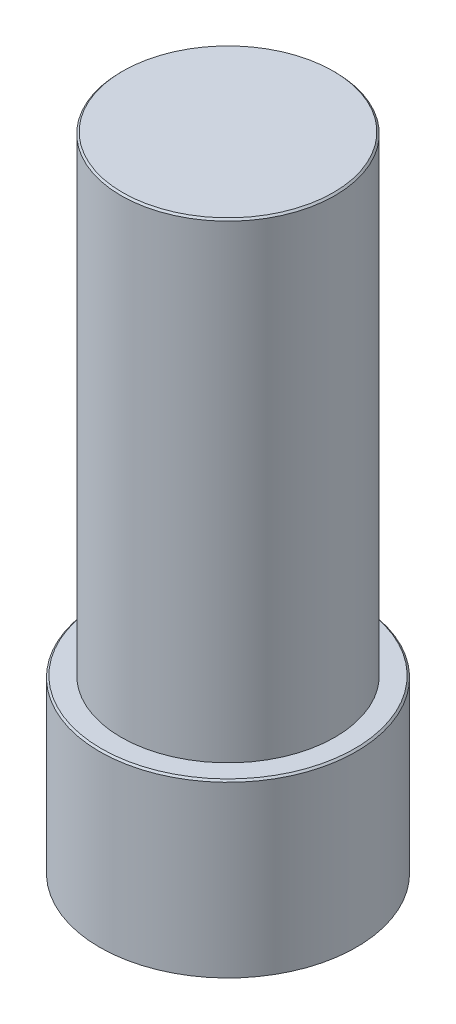
ISO-10303-21;
HEADER;
FILE_DESCRIPTION(('STEP AP214'),'2;1');
FILE_NAME('part.step','',(''),(''),'','','');
FILE_SCHEMA(('AUTOMOTIVE_DESIGN { 1 0 10303 214 1 1 1 1 }'));
ENDSEC;
DATA;
#1=APPLICATION_CONTEXT('core data for automotive mechanical design processes');
#2=APPLICATION_PROTOCOL_DEFINITION('international standard','automotive_design',2000,#1);
#3=PRODUCT_CONTEXT('',#1,'mechanical');
#4=PRODUCT('Part','Part','',(#3));
#5=PRODUCT_RELATED_PRODUCT_CATEGORY('part','',(#4));
#6=PRODUCT_DEFINITION_FORMATION('','',#4);
#7=PRODUCT_DEFINITION_CONTEXT('part definition',#1,'design');
#8=PRODUCT_DEFINITION('design','',#6,#7);
#9=PRODUCT_DEFINITION_SHAPE('','',#8);
#10=(LENGTH_UNIT() NAMED_UNIT(*) SI_UNIT(.MILLI.,.METRE.));
#11=(NAMED_UNIT(*) PLANE_ANGLE_UNIT() SI_UNIT($,.RADIAN.));
#12=(NAMED_UNIT(*) SI_UNIT($,.STERADIAN.) SOLID_ANGLE_UNIT());
#13=UNCERTAINTY_MEASURE_WITH_UNIT(LENGTH_MEASURE(1.E-05),#10,'distance_accuracy_value','');
#14=(GEOMETRIC_REPRESENTATION_CONTEXT(3) GLOBAL_UNCERTAINTY_ASSIGNED_CONTEXT((#13)) GLOBAL_UNIT_ASSIGNED_CONTEXT((#10,
#11,#12)) REPRESENTATION_CONTEXT('',''));
#15=CARTESIAN_POINT('',(0.,0.,0.));
#16=DIRECTION('',(0.,0.,1.));
#17=DIRECTION('',(1.,0.,0.));
#18=AXIS2_PLACEMENT_3D('',#15,#16,#17);
#19=CARTESIAN_POINT('',(0.,75.,0.));
#20=DIRECTION('',(0.,-1.,0.));
#21=DIRECTION('',(0.,0.,-1.));
#22=AXIS2_PLACEMENT_3D('',#19,#20,#21);
#23=CYLINDRICAL_SURFACE('',#22,15.);
#24=CARTESIAN_POINT('',(0.,19.8,0.));
#25=DIRECTION('',(0.,1.,0.));
#26=DIRECTION('',(0.,0.,1.));
#27=AXIS2_PLACEMENT_3D('',#24,#25,#26);
#28=CIRCLE('',#27,15.);
#29=CARTESIAN_POINT('',(0.,19.8,15.));
#30=VERTEX_POINT('',#29);
#31=EDGE_CURVE('E132',#30,#30,#28,.F.);
#32=ORIENTED_EDGE('',*,*,#31,.T.);
#33=EDGE_LOOP('',(#32));
#34=FACE_BOUND('',#33,.T.);
#35=CARTESIAN_POINT('',(0.,0.,0.));
#36=DIRECTION('',(0.,1.,0.));
#37=DIRECTION('',(0.,0.,1.));
#38=AXIS2_PLACEMENT_3D('',#35,#36,#37);
#39=CIRCLE('',#38,15.);
#40=CARTESIAN_POINT('',(0.,0.,15.));
#41=VERTEX_POINT('',#40);
#42=EDGE_CURVE('E124',#41,#41,#39,.T.);
#43=ORIENTED_EDGE('',*,*,#42,.T.);
#44=EDGE_LOOP('',(#43));
#45=FACE_BOUND('',#44,.T.);
#46=ADVANCED_FACE('F41',(#34,#45),#23,.T.);
#47=CARTESIAN_POINT('',(0.,0.,0.));
#48=DIRECTION('',(0.,1.,0.));
#49=DIRECTION('',(0.,0.,1.));
#50=AXIS2_PLACEMENT_3D('',#47,#48,#49);
#51=PLANE('',#50);
#52=ORIENTED_EDGE('',*,*,#42,.F.);
#53=EDGE_LOOP('',(#52));
#54=FACE_BOUND('',#53,.T.);
#55=ADVANCED_FACE('F185',(#54),#51,.F.);
#56=CARTESIAN_POINT('',(0.,20.,0.));
#57=DIRECTION('',(0.,1.,0.));
#58=DIRECTION('',(0.,0.,1.));
#59=AXIS2_PLACEMENT_3D('',#56,#57,#58);
#60=PLANE('',#59);
#61=CARTESIAN_POINT('',(0.,20.,0.));
#62=DIRECTION('',(0.,1.,0.));
#63=DIRECTION('',(0.,0.,1.));
#64=AXIS2_PLACEMENT_3D('',#61,#62,#63);
#65=CIRCLE('',#64,14.8);
#66=CARTESIAN_POINT('',(0.,20.,14.8));
#67=VERTEX_POINT('',#66);
#68=EDGE_CURVE('E128',#67,#67,#65,.T.);
#69=ORIENTED_EDGE('',*,*,#68,.T.);
#70=EDGE_LOOP('',(#69));
#71=FACE_BOUND('',#70,.T.);
#72=CARTESIAN_POINT('',(0.,20.,0.));
#73=DIRECTION('',(0.,1.,0.));
#74=DIRECTION('',(0.,0.,1.));
#75=AXIS2_PLACEMENT_3D('',#72,#73,#74);
#76=CIRCLE('',#75,12.5);
#77=CARTESIAN_POINT('',(0.,20.,12.5));
#78=VERTEX_POINT('',#77);
#79=EDGE_CURVE('E114',#78,#78,#76,.T.);
#80=ORIENTED_EDGE('',*,*,#79,.F.);
#81=EDGE_LOOP('',(#80));
#82=FACE_BOUND('',#81,.T.);
#83=ADVANCED_FACE('F179',(#71,#82),#60,.T.);
#84=CARTESIAN_POINT('',(0.,20.,0.));
#85=DIRECTION('',(0.,1.,0.));
#86=DIRECTION('',(0.,0.,1.));
#87=AXIS2_PLACEMENT_3D('',#84,#85,#86);
#88=CYLINDRICAL_SURFACE('',#87,12.5);
#89=CARTESIAN_POINT('',(3.25,45.,-12.0701077045733));
#90=CARTESIAN_POINT('',(3.25001054641698,44.9102469923514,-12.0700972014568));
#91=CARTESIAN_POINT('',(3.2462821971101,44.8205003351103,-12.0711085697672));
#92=CARTESIAN_POINT('',(3.23142964516638,44.6416806479744,-12.0750971218678));
#93=CARTESIAN_POINT('',(3.22030676327856,44.5526075006559,-12.0780739546028));
#94=CARTESIAN_POINT('',(3.19077775024691,44.3759470317223,-12.0859074104892));
#95=CARTESIAN_POINT('',(3.17238680541051,44.2883570066258,-12.0907601136305));
#96=CARTESIAN_POINT('',(3.12849426751624,44.1151162303061,-12.102191291883));
#97=CARTESIAN_POINT('',(3.10299256067524,44.0294655101386,-12.1087697946097));
#98=CARTESIAN_POINT('',(3.01610723550645,43.7763394826096,-12.1308168028862));
#99=CARTESIAN_POINT('',(2.94431200667787,43.612504190267,-12.1486056733553));
#100=CARTESIAN_POINT('',(2.7751834959888,43.2992323440276,-12.1883491724256));
#101=CARTESIAN_POINT('',(2.67784242416883,43.1498002012703,-12.2103050711557));
#102=CARTESIAN_POINT('',(2.45790723279837,42.8659697818068,-12.2564903841655));
#103=CARTESIAN_POINT('',(2.33481901404868,42.7319598995167,-12.2807582867324));
#104=CARTESIAN_POINT('',(2.06794376168588,42.4862329164713,-12.3285017577223));
#105=CARTESIAN_POINT('',(1.92415339609513,42.3745194112024,-12.3519771978473));
#106=CARTESIAN_POINT('',(1.61725751153118,42.1749378641374,-12.3959199464695));
#107=CARTESIAN_POINT('',(1.45389212276499,42.0874571740681,-12.416336231863));
#108=CARTESIAN_POINT('',(1.11416201723522,41.9413538371338,-12.4514159376555));
#109=CARTESIAN_POINT('',(0.937800013503568,41.8827251869403,-12.466080554692));
#110=CARTESIAN_POINT('',(0.581159693741104,41.7972449245453,-12.487732327864));
#111=CARTESIAN_POINT('',(0.401050786420688,41.7697278848197,-12.4948800160932));
#112=CARTESIAN_POINT('',(0.0386367576122468,41.7451603299802,-12.5012531822562));
#113=CARTESIAN_POINT('',(-0.143668058423004,41.7481056253152,-12.500479749599));
#114=CARTESIAN_POINT('',(-0.50066595555858,41.7839076611296,-12.4912158940811));
#115=CARTESIAN_POINT('',(-0.675436720490978,41.8160450885361,-12.4829110578883));
#116=CARTESIAN_POINT('',(-1.01701237228166,41.9081588608412,-12.459735475173));
#117=CARTESIAN_POINT('',(-1.18381689078128,41.9681364916968,-12.4448644253543));
#118=CARTESIAN_POINT('',(-1.5065891753543,42.114793443658,-12.409948350159));
#119=CARTESIAN_POINT('',(-1.66243761523551,42.2017234290582,-12.3898550527595));
#120=CARTESIAN_POINT('',(-1.95757909796545,42.3996212753068,-12.3466661055975));
#121=CARTESIAN_POINT('',(-2.09686940130557,42.510593105279,-12.3235699603401));
#122=CARTESIAN_POINT('',(-2.35922425296155,42.7572556655012,-12.276089499668));
#123=CARTESIAN_POINT('',(-2.48169820462864,42.8935720998935,-12.2516872576503));
#124=CARTESIAN_POINT('',(-2.70220949562019,43.1850632178379,-12.204949898371));
#125=CARTESIAN_POINT('',(-2.80024010996337,43.3402430737657,-12.1826153510449));
#126=CARTESIAN_POINT('',(-2.96954068537913,43.6664928224593,-12.142466983971));
#127=CARTESIAN_POINT('',(-3.04064266225175,43.8376544188678,-12.1246817597345));
#128=CARTESIAN_POINT('',(-3.12474953065326,44.1016655508393,-12.10317085816));
#129=CARTESIAN_POINT('',(-3.14902543900197,44.1908662208967,-12.0968622953971));
#130=CARTESIAN_POINT('',(-3.18990852784131,44.3711086819987,-12.0861465363928));
#131=CARTESIAN_POINT('',(-3.20651928989296,44.4621495923869,-12.0817384522109));
#132=CARTESIAN_POINT('',(-3.2294677615875,44.6276925302341,-12.0756222489095));
#133=CARTESIAN_POINT('',(-3.23716917287087,44.7019966464683,-12.0735573013183));
#134=CARTESIAN_POINT('',(-3.24743311280396,44.8508644561256,-12.0707988356085));
#135=CARTESIAN_POINT('',(-3.25000385063951,44.9254275433561,-12.0701031267038));
#136=CARTESIAN_POINT('',(-3.25,45.,-12.0701077045733));
#137=B_SPLINE_CURVE_WITH_KNOTS('',3,(#89,#90,#91,#92,#93,#94,#95,#96,#97,#98,#99,#100,#101,#102,
#103,#104,#105,#106,#107,#108,#109,#110,#111,#112,#113,#114,#115,#116,#117,#118,#119,#120,#121,
#122,#123,#124,#125,#126,#127,#128,#129,#130,#131,#132,#133,#134,#135,#136),.UNSPECIFIED.,.F.,
.F.,(4,2,2,2,2,2,2,2,2,2,2,2,2,2,2,2,2,2,2,2,2,2,2,4),(0.,0.269164995178561,0.538281927288888,
0.806839499077714,1.07540136844801,1.61196536344493,2.14869316898375,2.69686273622162,
3.24512062931408,3.80169373332475,4.35815098052082,4.90246697081595,5.44670810114643,
5.97789211842449,6.50910067387831,7.04540582944507,7.58179959243313,8.13381287845216,
8.68597787014817,9.24153272195672,9.51922343266718,9.79678425990766,10.0207947614027,
10.244446553097),.UNSPECIFIED.);
#138=CARTESIAN_POINT('',(3.25,45.,-12.0701077045733));
#139=VERTEX_POINT('',#138);
#140=CARTESIAN_POINT('',(-3.25,45.,-12.0701077045733));
#141=VERTEX_POINT('',#140);
#142=EDGE_CURVE('E144',#139,#141,#137,.T.);
#143=ORIENTED_EDGE('',*,*,#142,.F.);
#144=DIRECTION('',(0.,1.,0.));
#145=VECTOR('',#144,1.);
#146=CARTESIAN_POINT('',(3.24999999999999,20.,-12.0701077045733));
#147=LINE('',#146,#145);
#148=CARTESIAN_POINT('',(3.25,70.,-12.0701077045733));
#149=VERTEX_POINT('',#148);
#150=EDGE_CURVE('E11',#149,#139,#147,.F.);
#151=ORIENTED_EDGE('',*,*,#150,.F.);
#152=CARTESIAN_POINT('',(-3.25,70.,-12.0701077045733));
#153=CARTESIAN_POINT('',(-3.25001054641698,70.0897530076487,-12.0700972014568));
#154=CARTESIAN_POINT('',(-3.2462821971101,70.1794996648898,-12.0711085697672));
#155=CARTESIAN_POINT('',(-3.23142964516638,70.3583193520256,-12.0750971218678));
#156=CARTESIAN_POINT('',(-3.22030676327856,70.4473924993442,-12.0780739546028));
#157=CARTESIAN_POINT('',(-3.19077775024691,70.6240529682777,-12.0859074104892));
#158=CARTESIAN_POINT('',(-3.1723868054105,70.7116429933743,-12.0907601136305));
#159=CARTESIAN_POINT('',(-3.12849426751624,70.884883769694,-12.102191291883));
#160=CARTESIAN_POINT('',(-3.10299256067524,70.9705344898615,-12.1087697946097));
#161=CARTESIAN_POINT('',(-3.01610723550645,71.2236605173905,-12.1308168028862));
#162=CARTESIAN_POINT('',(-2.94431200667787,71.387495809733,-12.1486056733553));
#163=CARTESIAN_POINT('',(-2.7751834959888,71.7007676559724,-12.1883491724256));
#164=CARTESIAN_POINT('',(-2.67784242416882,71.8501997987297,-12.2103050711557));
#165=CARTESIAN_POINT('',(-2.45790723279836,72.1340302181932,-12.2564903841655));
#166=CARTESIAN_POINT('',(-2.33481901404868,72.2680401004833,-12.2807582867324));
#167=CARTESIAN_POINT('',(-2.06794376168588,72.5137670835287,-12.3285017577223));
#168=CARTESIAN_POINT('',(-1.92415339609513,72.6254805887976,-12.3519771978473));
#169=CARTESIAN_POINT('',(-1.61725751153118,72.8250621358626,-12.3959199464695));
#170=CARTESIAN_POINT('',(-1.45389212276498,72.912542825932,-12.416336231863));
#171=CARTESIAN_POINT('',(-1.11416201723522,73.0586461628663,-12.4514159376555));
#172=CARTESIAN_POINT('',(-0.937800013503566,73.1172748130598,-12.466080554692));
#173=CARTESIAN_POINT('',(-0.581159693741102,73.2027550754547,-12.487732327864));
#174=CARTESIAN_POINT('',(-0.401050786420685,73.2302721151803,-12.4948800160932));
#175=CARTESIAN_POINT('',(-0.038636757612244,73.2548396700199,-12.5012531822562));
#176=CARTESIAN_POINT('',(0.143668058423007,73.2518943746849,-12.500479749599));
#177=CARTESIAN_POINT('',(0.500665955558583,73.2160923388705,-12.4912158940811));
#178=CARTESIAN_POINT('',(0.675436720490983,73.1839549114639,-12.4829110578883));
#179=CARTESIAN_POINT('',(1.01701237228166,73.0918411391588,-12.459735475173));
#180=CARTESIAN_POINT('',(1.18381689078129,73.0318635083032,-12.4448644253543));
#181=CARTESIAN_POINT('',(1.5065891753543,72.8852065563421,-12.409948350159));
#182=CARTESIAN_POINT('',(1.66243761523551,72.7982765709419,-12.3898550527594));
#183=CARTESIAN_POINT('',(1.95757909796545,72.6003787246933,-12.3466661055975));
#184=CARTESIAN_POINT('',(2.09686940130557,72.4894068947211,-12.3235699603401));
#185=CARTESIAN_POINT('',(2.35922425296155,72.2427443344988,-12.276089499668));
#186=CARTESIAN_POINT('',(2.48169820462864,72.1064279001066,-12.2516872576503));
#187=CARTESIAN_POINT('',(2.70220949562019,71.8149367821622,-12.204949898371));
#188=CARTESIAN_POINT('',(2.80024010996337,71.6597569262344,-12.1826153510449));
#189=CARTESIAN_POINT('',(2.96954068537913,71.3335071775408,-12.142466983971));
#190=CARTESIAN_POINT('',(3.04064266225175,71.1623455811322,-12.1246817597345));
#191=CARTESIAN_POINT('',(3.12474953065326,70.8983344491607,-12.10317085816));
#192=CARTESIAN_POINT('',(3.14902543900197,70.8091337791034,-12.0968622953971));
#193=CARTESIAN_POINT('',(3.18990852784131,70.6288913180014,-12.0861465363928));
#194=CARTESIAN_POINT('',(3.20651928989296,70.5378504076132,-12.0817384522109));
#195=CARTESIAN_POINT('',(3.2294677615875,70.372307469766,-12.0756222489095));
#196=CARTESIAN_POINT('',(3.23716917287087,70.2980033535318,-12.0735573013183));
#197=CARTESIAN_POINT('',(3.24743311280396,70.1491355438745,-12.0707988356085));
#198=CARTESIAN_POINT('',(3.25000385063951,70.074572456644,-12.0701031267038));
#199=CARTESIAN_POINT('',(3.25,70.,-12.0701077045733));
#200=B_SPLINE_CURVE_WITH_KNOTS('',3,(#152,#153,#154,#155,#156,#157,#158,#159,#160,#161,#162,
#163,#164,#165,#166,#167,#168,#169,#170,#171,#172,#173,#174,#175,#176,#177,#178,#179,#180,#181,
#182,#183,#184,#185,#186,#187,#188,#189,#190,#191,#192,#193,#194,#195,#196,#197,#198,#199),
.UNSPECIFIED.,.F.,.F.,(4,2,2,2,2,2,2,2,2,2,2,2,2,2,2,2,2,2,2,2,2,2,2,4),(0.,0.269164995178554,
0.538281927288895,0.806839499077722,1.07540136844801,1.61196536344492,2.14869316898375,
2.69686273622162,3.24512062931407,3.80169373332475,4.35815098052082,4.90246697081595,
5.44670810114643,5.97789211842449,6.50910067387831,7.04540582944506,7.58179959243313,
8.13381287845215,8.68597787014817,9.24153272195671,9.51922343266718,9.79678425990767,
10.0207947614027,10.244446553097),.UNSPECIFIED.);
#201=CARTESIAN_POINT('',(-3.25,70.,-12.0701077045733));
#202=VERTEX_POINT('',#201);
#203=EDGE_CURVE('E51',#202,#149,#200,.T.);
#204=ORIENTED_EDGE('',*,*,#203,.F.);
#205=DIRECTION('',(0.,1.,0.));
#206=VECTOR('',#205,1.);
#207=CARTESIAN_POINT('',(-3.25,20.,-12.0701077045733));
#208=LINE('',#207,#206);
#209=EDGE_CURVE('E153',#141,#202,#208,.T.);
#210=ORIENTED_EDGE('',*,*,#209,.F.);
#211=EDGE_LOOP('',(#143,#151,#204,#210));
#212=FACE_BOUND('',#211,.T.);
#213=CARTESIAN_POINT('',(0.,74.8,0.));
#214=DIRECTION('',(0.,1.,0.));
#215=DIRECTION('',(0.,0.,1.));
#216=AXIS2_PLACEMENT_3D('',#213,#214,#215);
#217=CIRCLE('',#216,12.5);
#218=CARTESIAN_POINT('',(0.,74.8,12.5));
#219=VERTEX_POINT('',#218);
#220=EDGE_CURVE('E140',#219,#219,#217,.F.);
#221=ORIENTED_EDGE('',*,*,#220,.T.);
#222=EDGE_LOOP('',(#221));
#223=FACE_BOUND('',#222,.T.);
#224=ORIENTED_EDGE('',*,*,#79,.T.);
#225=EDGE_LOOP('',(#224));
#226=FACE_BOUND('',#225,.T.);
#227=ADVANCED_FACE('F154',(#212,#223,#226),#88,.T.);
#228=CARTESIAN_POINT('',(0.,75.,0.));
#229=DIRECTION('',(0.,1.,0.));
#230=DIRECTION('',(0.,0.,1.));
#231=AXIS2_PLACEMENT_3D('',#228,#229,#230);
#232=PLANE('',#231);
#233=CARTESIAN_POINT('',(0.,75.,0.));
#234=DIRECTION('',(0.,1.,0.));
#235=DIRECTION('',(0.,0.,1.));
#236=AXIS2_PLACEMENT_3D('',#233,#234,#235);
#237=CIRCLE('',#236,12.3);
#238=CARTESIAN_POINT('',(0.,75.,12.3));
#239=VERTEX_POINT('',#238);
#240=EDGE_CURVE('E136',#239,#239,#237,.T.);
#241=ORIENTED_EDGE('',*,*,#240,.T.);
#242=EDGE_LOOP('',(#241));
#243=FACE_BOUND('',#242,.T.);
#244=ADVANCED_FACE('F178',(#243),#232,.T.);
#245=CARTESIAN_POINT('',(0.,20.,0.));
#246=DIRECTION('',(0.,-1.,0.));
#247=DIRECTION('',(0.,0.,-1.));
#248=AXIS2_PLACEMENT_3D('',#245,#246,#247);
#249=CONICAL_SURFACE('',#248,14.8,0.785398163397444);
#250=ORIENTED_EDGE('',*,*,#31,.F.);
#251=EDGE_LOOP('',(#250));
#252=FACE_BOUND('',#251,.T.);
#253=ORIENTED_EDGE('',*,*,#68,.F.);
#254=EDGE_LOOP('',(#253));
#255=FACE_BOUND('',#254,.T.);
#256=ADVANCED_FACE('F200',(#252,#255),#249,.T.);
#257=CARTESIAN_POINT('',(0.,75.,0.));
#258=DIRECTION('',(0.,-1.,0.));
#259=DIRECTION('',(0.,0.,-1.));
#260=AXIS2_PLACEMENT_3D('',#257,#258,#259);
#261=CONICAL_SURFACE('',#260,12.3,0.785398163397457);
#262=ORIENTED_EDGE('',*,*,#220,.F.);
#263=EDGE_LOOP('',(#262));
#264=FACE_BOUND('',#263,.T.);
#265=ORIENTED_EDGE('',*,*,#240,.F.);
#266=EDGE_LOOP('',(#265));
#267=FACE_BOUND('',#266,.T.);
#268=ADVANCED_FACE('F44',(#264,#267),#261,.T.);
#269=CARTESIAN_POINT('',(0.,70.,-9.5));
#270=DIRECTION('',(0.,0.,-1.));
#271=DIRECTION('',(-1.,0.,0.));
#272=AXIS2_PLACEMENT_3D('',#269,#270,#271);
#273=CYLINDRICAL_SURFACE('',#272,3.25);
#274=DIRECTION('',(0.,0.,-1.));
#275=VECTOR('',#274,1.);
#276=CARTESIAN_POINT('',(-3.25,70.,-9.5));
#277=LINE('',#276,#275);
#278=CARTESIAN_POINT('',(-3.25,70.,-9.5));
#279=VERTEX_POINT('',#278);
#280=EDGE_CURVE('E111',#279,#202,#277,.T.);
#281=ORIENTED_EDGE('',*,*,#280,.T.);
#282=ORIENTED_EDGE('',*,*,#203,.T.);
#283=DIRECTION('',(0.,0.,-1.));
#284=VECTOR('',#283,1.);
#285=CARTESIAN_POINT('',(3.24999999999999,70.,-9.5));
#286=LINE('',#285,#284);
#287=CARTESIAN_POINT('',(3.24999999999999,70.,-9.5));
#288=VERTEX_POINT('',#287);
#289=EDGE_CURVE('E57',#288,#149,#286,.T.);
#290=ORIENTED_EDGE('',*,*,#289,.F.);
#291=CARTESIAN_POINT('',(0.,70.,-9.5));
#292=DIRECTION('',(0.,0.,-1.));
#293=DIRECTION('',(-1.,0.,0.));
#294=AXIS2_PLACEMENT_3D('',#291,#292,#293);
#295=CIRCLE('',#294,3.25);
#296=EDGE_CURVE('E86',#279,#288,#295,.T.);
#297=ORIENTED_EDGE('',*,*,#296,.F.);
#298=EDGE_LOOP('',(#281,#282,#290,#297));
#299=FACE_BOUND('',#298,.T.);
#300=ADVANCED_FACE('F84',(#299),#273,.F.);
#301=CARTESIAN_POINT('',(-3.25,70.,-9.5));
#302=DIRECTION('',(-1.,0.,0.));
#303=DIRECTION('',(0.,-1.,0.));
#304=AXIS2_PLACEMENT_3D('',#301,#302,#303);
#305=PLANE('',#304);
#306=ORIENTED_EDGE('',*,*,#209,.T.);
#307=ORIENTED_EDGE('',*,*,#280,.F.);
#308=DIRECTION('',(0.,1.,0.));
#309=VECTOR('',#308,1.);
#310=CARTESIAN_POINT('',(-3.25,70.,-9.5));
#311=LINE('',#310,#309);
#312=CARTESIAN_POINT('',(-3.25,45.,-9.5));
#313=VERTEX_POINT('',#312);
#314=EDGE_CURVE('E90',#313,#279,#311,.T.);
#315=ORIENTED_EDGE('',*,*,#314,.F.);
#316=DIRECTION('',(0.,0.,-1.));
#317=VECTOR('',#316,1.);
#318=CARTESIAN_POINT('',(-3.25,45.,-9.5));
#319=LINE('',#318,#317);
#320=EDGE_CURVE('E115',#313,#141,#319,.T.);
#321=ORIENTED_EDGE('',*,*,#320,.T.);
#322=EDGE_LOOP('',(#306,#307,#315,#321));
#323=FACE_BOUND('',#322,.T.);
#324=ADVANCED_FACE('F163',(#323),#305,.F.);
#325=CARTESIAN_POINT('',(0.,45.,-9.5));
#326=DIRECTION('',(0.,0.,-1.));
#327=DIRECTION('',(-1.,0.,0.));
#328=AXIS2_PLACEMENT_3D('',#325,#326,#327);
#329=CYLINDRICAL_SURFACE('',#328,3.25);
#330=DIRECTION('',(0.,0.,-1.));
#331=VECTOR('',#330,1.);
#332=CARTESIAN_POINT('',(3.25,45.,-9.5));
#333=LINE('',#332,#331);
#334=CARTESIAN_POINT('',(3.25,45.,-9.5));
#335=VERTEX_POINT('',#334);
#336=EDGE_CURVE('E89',#335,#139,#333,.T.);
#337=ORIENTED_EDGE('',*,*,#336,.T.);
#338=ORIENTED_EDGE('',*,*,#142,.T.);
#339=ORIENTED_EDGE('',*,*,#320,.F.);
#340=CARTESIAN_POINT('',(0.,45.,-9.5));
#341=DIRECTION('',(0.,0.,-1.));
#342=DIRECTION('',(-1.,0.,0.));
#343=AXIS2_PLACEMENT_3D('',#340,#341,#342);
#344=CIRCLE('',#343,3.25);
#345=EDGE_CURVE('E100',#335,#313,#344,.T.);
#346=ORIENTED_EDGE('',*,*,#345,.F.);
#347=EDGE_LOOP('',(#337,#338,#339,#346));
#348=FACE_BOUND('',#347,.T.);
#349=ADVANCED_FACE('F158',(#348),#329,.F.);
#350=CARTESIAN_POINT('',(3.24999999999999,70.,-9.5));
#351=DIRECTION('',(1.,0.,0.));
#352=DIRECTION('',(0.,1.,0.));
#353=AXIS2_PLACEMENT_3D('',#350,#351,#352);
#354=PLANE('',#353);
#355=ORIENTED_EDGE('',*,*,#150,.T.);
#356=ORIENTED_EDGE('',*,*,#336,.F.);
#357=DIRECTION('',(0.,-1.,0.));
#358=VECTOR('',#357,1.);
#359=CARTESIAN_POINT('',(3.24999999999999,70.,-9.5));
#360=LINE('',#359,#358);
#361=EDGE_CURVE('E93',#288,#335,#360,.T.);
#362=ORIENTED_EDGE('',*,*,#361,.F.);
#363=ORIENTED_EDGE('',*,*,#289,.T.);
#364=EDGE_LOOP('',(#355,#356,#362,#363));
#365=FACE_BOUND('',#364,.T.);
#366=ADVANCED_FACE('F94',(#365),#354,.F.);
#367=CARTESIAN_POINT('',(0.,70.,-9.5));
#368=DIRECTION('',(0.,0.,-1.));
#369=DIRECTION('',(-1.,0.,0.));
#370=AXIS2_PLACEMENT_3D('',#367,#368,#369);
#371=PLANE('',#370);
#372=ORIENTED_EDGE('',*,*,#296,.T.);
#373=ORIENTED_EDGE('',*,*,#361,.T.);
#374=ORIENTED_EDGE('',*,*,#345,.T.);
#375=ORIENTED_EDGE('',*,*,#314,.T.);
#376=EDGE_LOOP('',(#372,#373,#374,#375));
#377=FACE_BOUND('',#376,.T.);
#378=ADVANCED_FACE('F102',(#377),#371,.T.);
#379=CLOSED_SHELL('',(#46,#55,#83,#227,#244,#256,#268,#300,#324,#349,#366,#378));
#380=MANIFOLD_SOLID_BREP('B2',#379);
#381=ADVANCED_BREP_SHAPE_REPRESENTATION('',(#18,#380),#14);
#382=SHAPE_DEFINITION_REPRESENTATION(#9,#381);
ENDSEC;
END-ISO-10303-21;
